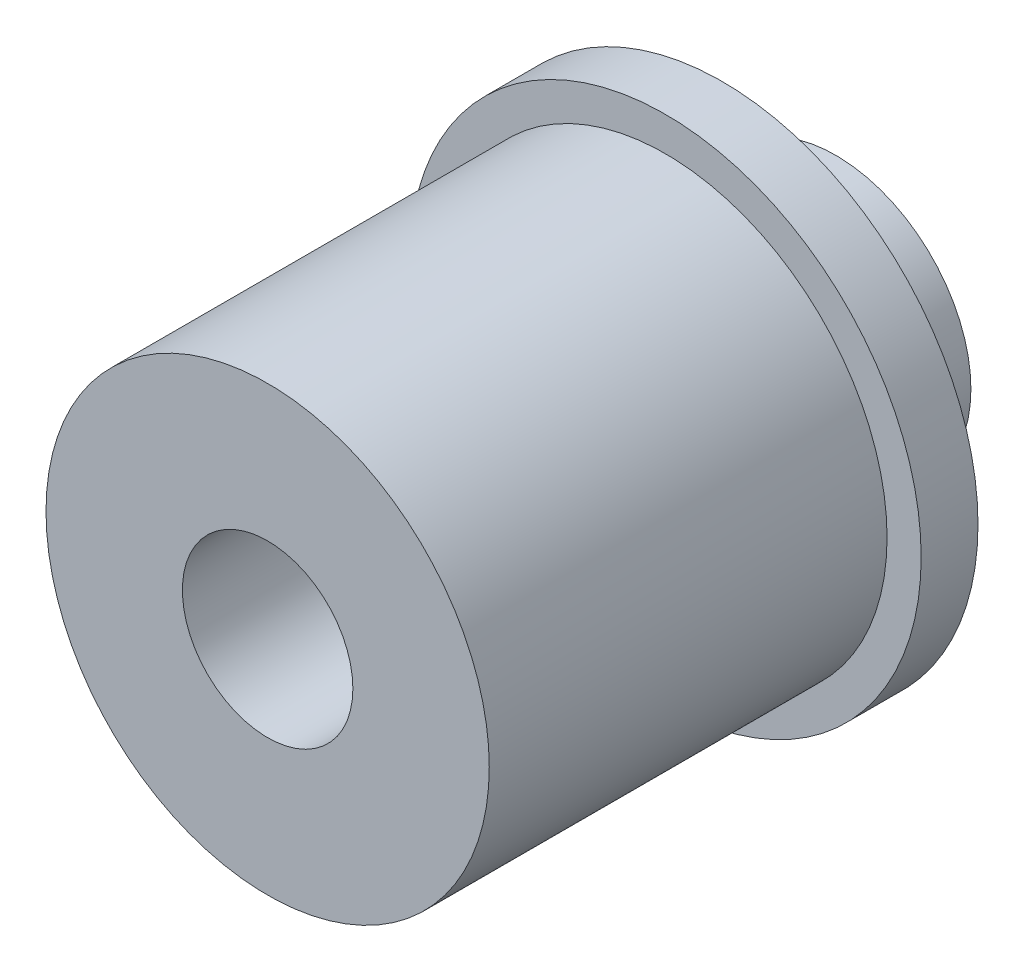
ISO-10303-21;
HEADER;
FILE_DESCRIPTION(('STEP AP214'),'2;1');
FILE_NAME('part.step','',(''),(''),'','','');
FILE_SCHEMA(('AUTOMOTIVE_DESIGN { 1 0 10303 214 1 1 1 1 }'));
ENDSEC;
DATA;
#1=APPLICATION_CONTEXT('core data for automotive mechanical design processes');
#2=APPLICATION_PROTOCOL_DEFINITION('international standard','automotive_design',2000,#1);
#3=PRODUCT_CONTEXT('',#1,'mechanical');
#4=PRODUCT('Part','Part','',(#3));
#5=PRODUCT_RELATED_PRODUCT_CATEGORY('part','',(#4));
#6=PRODUCT_DEFINITION_FORMATION('','',#4);
#7=PRODUCT_DEFINITION_CONTEXT('part definition',#1,'design');
#8=PRODUCT_DEFINITION('design','',#6,#7);
#9=PRODUCT_DEFINITION_SHAPE('','',#8);
#10=(LENGTH_UNIT() NAMED_UNIT(*) SI_UNIT(.MILLI.,.METRE.));
#11=(NAMED_UNIT(*) PLANE_ANGLE_UNIT() SI_UNIT($,.RADIAN.));
#12=(NAMED_UNIT(*) SI_UNIT($,.STERADIAN.) SOLID_ANGLE_UNIT());
#13=UNCERTAINTY_MEASURE_WITH_UNIT(LENGTH_MEASURE(1.E-05),#10,'distance_accuracy_value','');
#14=(GEOMETRIC_REPRESENTATION_CONTEXT(3) GLOBAL_UNCERTAINTY_ASSIGNED_CONTEXT((#13)) GLOBAL_UNIT_ASSIGNED_CONTEXT((#10,
#11,#12)) REPRESENTATION_CONTEXT('',''));
#15=CARTESIAN_POINT('',(0.,0.,0.));
#16=DIRECTION('',(0.,0.,1.));
#17=DIRECTION('',(1.,0.,0.));
#18=AXIS2_PLACEMENT_3D('',#15,#16,#17);
#19=CARTESIAN_POINT('',(0.,0.,0.));
#20=DIRECTION('',(0.,0.,1.));
#21=DIRECTION('',(1.,0.,0.));
#22=AXIS2_PLACEMENT_3D('',#19,#20,#21);
#23=PLANE('',#22);
#24=CARTESIAN_POINT('',(0.,0.,0.));
#25=DIRECTION('',(0.,0.,1.));
#26=DIRECTION('',(1.,0.,0.));
#27=AXIS2_PLACEMENT_3D('',#24,#25,#26);
#28=CIRCLE('',#27,2.375);
#29=CARTESIAN_POINT('',(2.375,0.,0.));
#30=VERTEX_POINT('',#29);
#31=EDGE_CURVE('E41',#30,#30,#28,.T.);
#32=ORIENTED_EDGE('',*,*,#31,.F.);
#33=EDGE_LOOP('',(#32));
#34=FACE_BOUND('',#33,.T.);
#35=CARTESIAN_POINT('',(0.,0.,0.));
#36=DIRECTION('',(0.,0.,1.));
#37=DIRECTION('',(1.,0.,0.));
#38=AXIS2_PLACEMENT_3D('',#35,#36,#37);
#39=CIRCLE('',#38,1.6);
#40=CARTESIAN_POINT('',(1.6,0.,0.));
#41=VERTEX_POINT('',#40);
#42=EDGE_CURVE('E66',#41,#41,#39,.T.);
#43=ORIENTED_EDGE('',*,*,#42,.T.);
#44=EDGE_LOOP('',(#43));
#45=FACE_BOUND('',#44,.T.);
#46=ADVANCED_FACE('F37',(#34,#45),#23,.F.);
#47=CARTESIAN_POINT('',(0.,0.,2.));
#48=DIRECTION('',(0.,0.,-1.));
#49=DIRECTION('',(-1.,0.,0.));
#50=AXIS2_PLACEMENT_3D('',#47,#48,#49);
#51=CYLINDRICAL_SURFACE('',#50,2.375);
#52=CARTESIAN_POINT('',(0.,0.,2.));
#53=DIRECTION('',(0.,0.,1.));
#54=DIRECTION('',(1.,0.,0.));
#55=AXIS2_PLACEMENT_3D('',#52,#53,#54);
#56=CIRCLE('',#55,2.375);
#57=CARTESIAN_POINT('',(2.375,0.,2.));
#58=VERTEX_POINT('',#57);
#59=EDGE_CURVE('E45',#58,#58,#56,.T.);
#60=ORIENTED_EDGE('',*,*,#59,.F.);
#61=EDGE_LOOP('',(#60));
#62=FACE_BOUND('',#61,.T.);
#63=ORIENTED_EDGE('',*,*,#31,.T.);
#64=EDGE_LOOP('',(#63));
#65=FACE_BOUND('',#64,.T.);
#66=ADVANCED_FACE('F39',(#62,#65),#51,.T.);
#67=CARTESIAN_POINT('',(0.,0.,2.));
#68=DIRECTION('',(0.,0.,-1.));
#69=DIRECTION('',(-1.,0.,0.));
#70=AXIS2_PLACEMENT_3D('',#67,#68,#69);
#71=CYLINDRICAL_SURFACE('',#70,1.6);
#72=CARTESIAN_POINT('',(0.,0.,2.));
#73=DIRECTION('',(0.,0.,1.));
#74=DIRECTION('',(1.,0.,0.));
#75=AXIS2_PLACEMENT_3D('',#72,#73,#74);
#76=CIRCLE('',#75,1.6);
#77=CARTESIAN_POINT('',(1.6,0.,2.));
#78=VERTEX_POINT('',#77);
#79=EDGE_CURVE('E61',#78,#78,#76,.T.);
#80=ORIENTED_EDGE('',*,*,#79,.T.);
#81=EDGE_LOOP('',(#80));
#82=FACE_BOUND('',#81,.T.);
#83=ORIENTED_EDGE('',*,*,#42,.F.);
#84=EDGE_LOOP('',(#83));
#85=FACE_BOUND('',#84,.T.);
#86=ADVANCED_FACE('F78',(#82,#85),#71,.F.);
#87=CARTESIAN_POINT('',(0.,0.,2.));
#88=DIRECTION('',(0.,0.,1.));
#89=DIRECTION('',(1.,0.,0.));
#90=AXIS2_PLACEMENT_3D('',#87,#88,#89);
#91=PLANE('',#90);
#92=CARTESIAN_POINT('',(0.,0.,2.));
#93=DIRECTION('',(0.,0.,1.));
#94=DIRECTION('',(1.,0.,0.));
#95=AXIS2_PLACEMENT_3D('',#92,#93,#94);
#96=CIRCLE('',#95,1.5);
#97=CARTESIAN_POINT('',(1.5,0.,2.));
#98=VERTEX_POINT('',#97);
#99=EDGE_CURVE('E54',#98,#98,#96,.T.);
#100=ORIENTED_EDGE('',*,*,#99,.T.);
#101=EDGE_LOOP('',(#100));
#102=FACE_BOUND('',#101,.T.);
#103=ORIENTED_EDGE('',*,*,#79,.F.);
#104=EDGE_LOOP('',(#103));
#105=FACE_BOUND('',#104,.T.);
#106=ADVANCED_FACE('F83',(#102,#105),#91,.F.);
#107=CARTESIAN_POINT('',(0.,0.,3.));
#108=DIRECTION('',(0.,0.,1.));
#109=DIRECTION('',(1.,0.,0.));
#110=AXIS2_PLACEMENT_3D('',#107,#108,#109);
#111=PLANE('',#110);
#112=CARTESIAN_POINT('',(0.,0.,3.));
#113=DIRECTION('',(0.,0.,1.));
#114=DIRECTION('',(1.,0.,0.));
#115=AXIS2_PLACEMENT_3D('',#112,#113,#114);
#116=CIRCLE('',#115,3.9);
#117=CARTESIAN_POINT('',(3.9,0.,3.));
#118=VERTEX_POINT('',#117);
#119=EDGE_CURVE('E10',#118,#118,#116,.T.);
#120=ORIENTED_EDGE('',*,*,#119,.F.);
#121=EDGE_LOOP('',(#120));
#122=FACE_BOUND('',#121,.T.);
#123=CARTESIAN_POINT('',(0.,0.,3.));
#124=DIRECTION('',(0.,0.,1.));
#125=DIRECTION('',(1.,0.,0.));
#126=AXIS2_PLACEMENT_3D('',#123,#124,#125);
#127=CIRCLE('',#126,4.5);
#128=CARTESIAN_POINT('',(4.5,0.,3.));
#129=VERTEX_POINT('',#128);
#130=EDGE_CURVE('E58',#129,#129,#127,.T.);
#131=ORIENTED_EDGE('',*,*,#130,.T.);
#132=EDGE_LOOP('',(#131));
#133=FACE_BOUND('',#132,.T.);
#134=ADVANCED_FACE('F93',(#122,#133),#111,.T.);
#135=ORIENTED_EDGE('',*,*,#59,.T.);
#136=EDGE_LOOP('',(#135));
#137=FACE_BOUND('',#136,.T.);
#138=CARTESIAN_POINT('',(0.,0.,2.));
#139=DIRECTION('',(0.,0.,1.));
#140=DIRECTION('',(1.,0.,0.));
#141=AXIS2_PLACEMENT_3D('',#138,#139,#140);
#142=CIRCLE('',#141,4.5);
#143=CARTESIAN_POINT('',(4.5,0.,2.));
#144=VERTEX_POINT('',#143);
#145=EDGE_CURVE('E57',#144,#144,#142,.T.);
#146=ORIENTED_EDGE('',*,*,#145,.F.);
#147=EDGE_LOOP('',(#146));
#148=FACE_BOUND('',#147,.T.);
#149=ADVANCED_FACE('F89',(#137,#148),#91,.F.);
#150=CARTESIAN_POINT('',(0.,0.,3.));
#151=DIRECTION('',(0.,0.,-1.));
#152=DIRECTION('',(-1.,0.,0.));
#153=AXIS2_PLACEMENT_3D('',#150,#151,#152);
#154=CYLINDRICAL_SURFACE('',#153,4.5);
#155=ORIENTED_EDGE('',*,*,#130,.F.);
#156=EDGE_LOOP('',(#155));
#157=FACE_BOUND('',#156,.T.);
#158=ORIENTED_EDGE('',*,*,#145,.T.);
#159=EDGE_LOOP('',(#158));
#160=FACE_BOUND('',#159,.T.);
#161=ADVANCED_FACE('F85',(#157,#160),#154,.T.);
#162=CARTESIAN_POINT('',(0.,0.,3.));
#163=DIRECTION('',(0.,0.,-1.));
#164=DIRECTION('',(-1.,0.,0.));
#165=AXIS2_PLACEMENT_3D('',#162,#163,#164);
#166=CYLINDRICAL_SURFACE('',#165,1.5);
#167=ORIENTED_EDGE('',*,*,#99,.F.);
#168=EDGE_LOOP('',(#167));
#169=FACE_BOUND('',#168,.T.);
#170=CARTESIAN_POINT('',(0.,0.,10.));
#171=DIRECTION('',(0.,0.,1.));
#172=DIRECTION('',(1.,0.,0.));
#173=AXIS2_PLACEMENT_3D('',#170,#171,#172);
#174=CIRCLE('',#173,1.5);
#175=CARTESIAN_POINT('',(1.5,0.,10.));
#176=VERTEX_POINT('',#175);
#177=EDGE_CURVE('E115',#176,#176,#174,.T.);
#178=ORIENTED_EDGE('',*,*,#177,.T.);
#179=EDGE_LOOP('',(#178));
#180=FACE_BOUND('',#179,.T.);
#181=ADVANCED_FACE('F88',(#169,#180),#166,.F.);
#182=CARTESIAN_POINT('',(0.,0.,10.));
#183=DIRECTION('',(0.,0.,1.));
#184=DIRECTION('',(1.,0.,0.));
#185=AXIS2_PLACEMENT_3D('',#182,#183,#184);
#186=PLANE('',#185);
#187=CARTESIAN_POINT('',(0.,0.,10.));
#188=DIRECTION('',(0.,0.,1.));
#189=DIRECTION('',(1.,0.,0.));
#190=AXIS2_PLACEMENT_3D('',#187,#188,#189);
#191=CIRCLE('',#190,3.9);
#192=CARTESIAN_POINT('',(3.9,0.,10.));
#193=VERTEX_POINT('',#192);
#194=EDGE_CURVE('E52',#193,#193,#191,.T.);
#195=ORIENTED_EDGE('',*,*,#194,.T.);
#196=EDGE_LOOP('',(#195));
#197=FACE_BOUND('',#196,.T.);
#198=ORIENTED_EDGE('',*,*,#177,.F.);
#199=EDGE_LOOP('',(#198));
#200=FACE_BOUND('',#199,.T.);
#201=ADVANCED_FACE('F100',(#197,#200),#186,.T.);
#202=CARTESIAN_POINT('',(0.,0.,10.));
#203=DIRECTION('',(0.,0.,-1.));
#204=DIRECTION('',(-1.,0.,0.));
#205=AXIS2_PLACEMENT_3D('',#202,#203,#204);
#206=CYLINDRICAL_SURFACE('',#205,3.9);
#207=ORIENTED_EDGE('',*,*,#194,.F.);
#208=EDGE_LOOP('',(#207));
#209=FACE_BOUND('',#208,.T.);
#210=ORIENTED_EDGE('',*,*,#119,.T.);
#211=EDGE_LOOP('',(#210));
#212=FACE_BOUND('',#211,.T.);
#213=ADVANCED_FACE('F102',(#209,#212),#206,.T.);
#214=CLOSED_SHELL('',(#46,#66,#86,#106,#134,#149,#161,#181,#201,#213));
#215=MANIFOLD_SOLID_BREP('B2',#214);
#216=ADVANCED_BREP_SHAPE_REPRESENTATION('',(#18,#215),#14);
#217=SHAPE_DEFINITION_REPRESENTATION(#9,#216);
ENDSEC;
END-ISO-10303-21;
